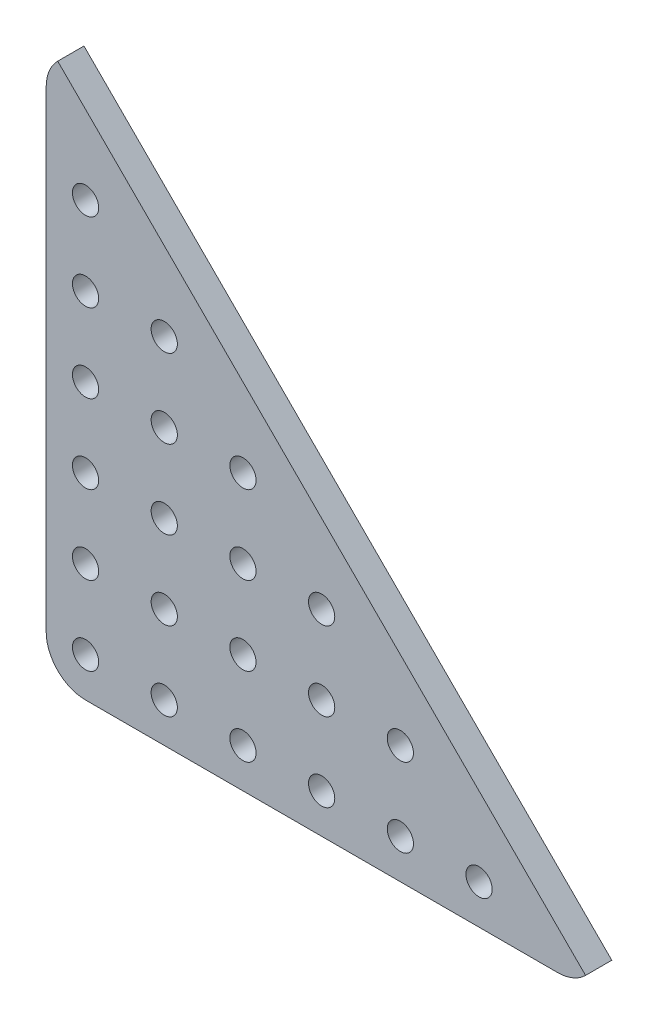
ISO-10303-21;
HEADER;
FILE_DESCRIPTION(('STEP AP214'),'2;1');
FILE_NAME('part.step','',(''),(''),'','','');
FILE_SCHEMA(('AUTOMOTIVE_DESIGN { 1 0 10303 214 1 1 1 1 }'));
ENDSEC;
DATA;
#1=APPLICATION_CONTEXT('core data for automotive mechanical design processes');
#2=APPLICATION_PROTOCOL_DEFINITION('international standard','automotive_design',2000,#1);
#3=PRODUCT_CONTEXT('',#1,'mechanical');
#4=PRODUCT('Part','Part','',(#3));
#5=PRODUCT_RELATED_PRODUCT_CATEGORY('part','',(#4));
#6=PRODUCT_DEFINITION_FORMATION('','',#4);
#7=PRODUCT_DEFINITION_CONTEXT('part definition',#1,'design');
#8=PRODUCT_DEFINITION('design','',#6,#7);
#9=PRODUCT_DEFINITION_SHAPE('','',#8);
#10=(LENGTH_UNIT() NAMED_UNIT(*) SI_UNIT(.MILLI.,.METRE.));
#11=(NAMED_UNIT(*) PLANE_ANGLE_UNIT() SI_UNIT($,.RADIAN.));
#12=(NAMED_UNIT(*) SI_UNIT($,.STERADIAN.) SOLID_ANGLE_UNIT());
#13=UNCERTAINTY_MEASURE_WITH_UNIT(LENGTH_MEASURE(1.E-05),#10,'distance_accuracy_value','');
#14=(GEOMETRIC_REPRESENTATION_CONTEXT(3) GLOBAL_UNCERTAINTY_ASSIGNED_CONTEXT((#13)) GLOBAL_UNIT_ASSIGNED_CONTEXT((#10,
#11,#12)) REPRESENTATION_CONTEXT('',''));
#15=CARTESIAN_POINT('',(0.,0.,0.));
#16=DIRECTION('',(0.,0.,1.));
#17=DIRECTION('',(1.,0.,0.));
#18=AXIS2_PLACEMENT_3D('',#15,#16,#17);
#19=CARTESIAN_POINT('',(-101.443383637,101.056539337921,3.));
#20=DIRECTION('',(0.,0.,1.));
#21=DIRECTION('',(1.,0.,0.));
#22=AXIS2_PLACEMENT_3D('',#19,#20,#21);
#23=PLANE('',#22);
#24=CARTESIAN_POINT('',(-65.443383637,47.056539338,3.));
#25=DIRECTION('',(0.,0.,1.));
#26=DIRECTION('',(1.,0.,0.));
#27=AXIS2_PLACEMENT_3D('',#24,#25,#26);
#28=CIRCLE('',#27,1.5);
#29=CARTESIAN_POINT('',(-63.943383637,47.056539338,3.));
#30=VERTEX_POINT('',#29);
#31=EDGE_CURVE('E258',#30,#30,#28,.T.);
#32=ORIENTED_EDGE('',*,*,#31,.F.);
#33=EDGE_LOOP('',(#32));
#34=FACE_BOUND('',#33,.T.);
#35=CARTESIAN_POINT('',(-83.443383637,47.056539338,3.));
#36=DIRECTION('',(0.,0.,1.));
#37=DIRECTION('',(1.,0.,0.));
#38=AXIS2_PLACEMENT_3D('',#35,#36,#37);
#39=CIRCLE('',#38,1.5);
#40=CARTESIAN_POINT('',(-81.943383637,47.056539338,3.));
#41=VERTEX_POINT('',#40);
#42=EDGE_CURVE('E270',#41,#41,#39,.T.);
#43=ORIENTED_EDGE('',*,*,#42,.F.);
#44=EDGE_LOOP('',(#43));
#45=FACE_BOUND('',#44,.T.);
#46=CARTESIAN_POINT('',(-101.443383637,47.056539338,3.));
#47=DIRECTION('',(0.,0.,1.));
#48=DIRECTION('',(1.,0.,0.));
#49=AXIS2_PLACEMENT_3D('',#46,#47,#48);
#50=CIRCLE('',#49,1.5);
#51=CARTESIAN_POINT('',(-99.943383637,47.056539338,3.));
#52=VERTEX_POINT('',#51);
#53=EDGE_CURVE('E282',#52,#52,#50,.T.);
#54=ORIENTED_EDGE('',*,*,#53,.F.);
#55=EDGE_LOOP('',(#54));
#56=FACE_BOUND('',#55,.T.);
#57=CARTESIAN_POINT('',(-74.443383637,56.056539338,3.));
#58=DIRECTION('',(0.,0.,1.));
#59=DIRECTION('',(1.,0.,0.));
#60=AXIS2_PLACEMENT_3D('',#57,#58,#59);
#61=CIRCLE('',#60,1.5);
#62=CARTESIAN_POINT('',(-72.943383637,56.056539338,3.));
#63=VERTEX_POINT('',#62);
#64=EDGE_CURVE('E294',#63,#63,#61,.T.);
#65=ORIENTED_EDGE('',*,*,#64,.F.);
#66=EDGE_LOOP('',(#65));
#67=FACE_BOUND('',#66,.T.);
#68=CARTESIAN_POINT('',(-92.443383637,56.056539338,3.));
#69=DIRECTION('',(0.,0.,1.));
#70=DIRECTION('',(1.,0.,0.));
#71=AXIS2_PLACEMENT_3D('',#68,#69,#70);
#72=CIRCLE('',#71,1.5);
#73=CARTESIAN_POINT('',(-90.943383637,56.056539338,3.));
#74=VERTEX_POINT('',#73);
#75=EDGE_CURVE('E306',#74,#74,#72,.T.);
#76=ORIENTED_EDGE('',*,*,#75,.F.);
#77=EDGE_LOOP('',(#76));
#78=FACE_BOUND('',#77,.T.);
#79=CARTESIAN_POINT('',(-74.443383637,65.056539338,3.));
#80=DIRECTION('',(0.,0.,1.));
#81=DIRECTION('',(1.,0.,0.));
#82=AXIS2_PLACEMENT_3D('',#79,#80,#81);
#83=CIRCLE('',#82,1.5);
#84=CARTESIAN_POINT('',(-72.943383637,65.056539338,3.));
#85=VERTEX_POINT('',#84);
#86=EDGE_CURVE('E318',#85,#85,#83,.T.);
#87=ORIENTED_EDGE('',*,*,#86,.F.);
#88=EDGE_LOOP('',(#87));
#89=FACE_BOUND('',#88,.T.);
#90=CARTESIAN_POINT('',(-92.443383637,65.056539338,3.));
#91=DIRECTION('',(0.,0.,1.));
#92=DIRECTION('',(1.,0.,0.));
#93=AXIS2_PLACEMENT_3D('',#90,#91,#92);
#94=CIRCLE('',#93,1.5);
#95=CARTESIAN_POINT('',(-90.943383637,65.056539338,3.));
#96=VERTEX_POINT('',#95);
#97=EDGE_CURVE('E330',#96,#96,#94,.T.);
#98=ORIENTED_EDGE('',*,*,#97,.F.);
#99=EDGE_LOOP('',(#98));
#100=FACE_BOUND('',#99,.T.);
#101=CARTESIAN_POINT('',(-83.443383637,74.056539338,3.));
#102=DIRECTION('',(0.,0.,1.));
#103=DIRECTION('',(1.,0.,0.));
#104=AXIS2_PLACEMENT_3D('',#101,#102,#103);
#105=CIRCLE('',#104,1.5);
#106=CARTESIAN_POINT('',(-81.943383637,74.056539338,3.));
#107=VERTEX_POINT('',#106);
#108=EDGE_CURVE('E342',#107,#107,#105,.T.);
#109=ORIENTED_EDGE('',*,*,#108,.F.);
#110=EDGE_LOOP('',(#109));
#111=FACE_BOUND('',#110,.T.);
#112=CARTESIAN_POINT('',(-101.443383637,74.056539338,3.));
#113=DIRECTION('',(0.,0.,1.));
#114=DIRECTION('',(1.,0.,0.));
#115=AXIS2_PLACEMENT_3D('',#112,#113,#114);
#116=CIRCLE('',#115,1.5);
#117=CARTESIAN_POINT('',(-99.943383637,74.056539338,3.));
#118=VERTEX_POINT('',#117);
#119=EDGE_CURVE('E354',#118,#118,#116,.T.);
#120=ORIENTED_EDGE('',*,*,#119,.F.);
#121=EDGE_LOOP('',(#120));
#122=FACE_BOUND('',#121,.T.);
#123=CARTESIAN_POINT('',(-101.443383637,83.056539338,3.));
#124=DIRECTION('',(0.,0.,1.));
#125=DIRECTION('',(1.,0.,0.));
#126=AXIS2_PLACEMENT_3D('',#123,#124,#125);
#127=CIRCLE('',#126,1.5);
#128=CARTESIAN_POINT('',(-99.943383637,83.056539338,3.));
#129=VERTEX_POINT('',#128);
#130=EDGE_CURVE('E366',#129,#129,#127,.T.);
#131=ORIENTED_EDGE('',*,*,#130,.F.);
#132=EDGE_LOOP('',(#131));
#133=FACE_BOUND('',#132,.T.);
#134=CARTESIAN_POINT('',(-101.443383637,101.056539337921,3.));
#135=DIRECTION('',(0.,0.,1.));
#136=DIRECTION('',(1.,0.,0.));
#137=AXIS2_PLACEMENT_3D('',#134,#135,#136);
#138=CIRCLE('',#137,4.50000000000001);
#139=CARTESIAN_POINT('',(-104.6253641523,104.2385198533,3.));
#140=VERTEX_POINT('',#139);
#141=CARTESIAN_POINT('',(-105.943383637,101.056539338,3.));
#142=VERTEX_POINT('',#141);
#143=EDGE_CURVE('E129',#140,#142,#138,.T.);
#144=ORIENTED_EDGE('',*,*,#143,.T.);
#145=DIRECTION('',(0.,-1.,0.));
#146=VECTOR('',#145,1.);
#147=CARTESIAN_POINT('',(-105.943383637,101.056539338,3.));
#148=LINE('',#147,#146);
#149=CARTESIAN_POINT('',(-105.943383637,47.056539338,3.));
#150=VERTEX_POINT('',#149);
#151=EDGE_CURVE('E87',#142,#150,#148,.T.);
#152=ORIENTED_EDGE('',*,*,#151,.T.);
#153=CARTESIAN_POINT('',(-101.443383637,47.056539338,3.));
#154=DIRECTION('',(0.,0.,1.));
#155=DIRECTION('',(1.,0.,0.));
#156=AXIS2_PLACEMENT_3D('',#153,#154,#155);
#157=CIRCLE('',#156,4.5);
#158=CARTESIAN_POINT('',(-101.443383637,42.556539338,3.));
#159=VERTEX_POINT('',#158);
#160=EDGE_CURVE('E100',#150,#159,#157,.T.);
#161=ORIENTED_EDGE('',*,*,#160,.T.);
#162=DIRECTION('',(1.,0.,0.));
#163=VECTOR('',#162,1.);
#164=CARTESIAN_POINT('',(-101.443383637,42.556539338,3.));
#165=LINE('',#164,#163);
#166=CARTESIAN_POINT('',(-47.443383637,42.556539338,3.));
#167=VERTEX_POINT('',#166);
#168=EDGE_CURVE('E94',#159,#167,#165,.T.);
#169=ORIENTED_EDGE('',*,*,#168,.T.);
#170=CARTESIAN_POINT('',(-47.4433836370789,47.056539338,3.));
#171=DIRECTION('',(0.,0.,1.));
#172=DIRECTION('',(1.,0.,0.));
#173=AXIS2_PLACEMENT_3D('',#170,#171,#172);
#174=CIRCLE('',#173,4.5);
#175=CARTESIAN_POINT('',(-44.2614031217,43.8745588227,3.));
#176=VERTEX_POINT('',#175);
#177=EDGE_CURVE('E98',#167,#176,#174,.T.);
#178=ORIENTED_EDGE('',*,*,#177,.T.);
#179=DIRECTION('',(-0.707106781186547,0.707106781186548,0.));
#180=VECTOR('',#179,1.);
#181=CARTESIAN_POINT('',(-104.6253641523,104.2385198533,3.));
#182=LINE('',#181,#180);
#183=EDGE_CURVE('E50',#176,#140,#182,.T.);
#184=ORIENTED_EDGE('',*,*,#183,.T.);
#185=EDGE_LOOP('',(#144,#152,#161,#169,#178,#184));
#186=FACE_BOUND('',#185,.T.);
#187=CARTESIAN_POINT('',(-101.443383637,92.056539338,3.));
#188=DIRECTION('',(0.,0.,1.));
#189=DIRECTION('',(1.,0.,0.));
#190=AXIS2_PLACEMENT_3D('',#187,#188,#189);
#191=CIRCLE('',#190,1.5);
#192=CARTESIAN_POINT('',(-99.943383637,92.056539338,3.));
#193=VERTEX_POINT('',#192);
#194=EDGE_CURVE('E122',#193,#193,#191,.T.);
#195=ORIENTED_EDGE('',*,*,#194,.F.);
#196=EDGE_LOOP('',(#195));
#197=FACE_BOUND('',#196,.T.);
#198=CARTESIAN_POINT('',(-92.443383637,83.056539338,3.));
#199=DIRECTION('',(0.,0.,1.));
#200=DIRECTION('',(1.,0.,0.));
#201=AXIS2_PLACEMENT_3D('',#198,#199,#200);
#202=CIRCLE('',#201,1.5);
#203=CARTESIAN_POINT('',(-90.943383637,83.056539338,3.));
#204=VERTEX_POINT('',#203);
#205=EDGE_CURVE('E360',#204,#204,#202,.T.);
#206=ORIENTED_EDGE('',*,*,#205,.F.);
#207=EDGE_LOOP('',(#206));
#208=FACE_BOUND('',#207,.T.);
#209=CARTESIAN_POINT('',(-92.443383637,74.056539338,3.));
#210=DIRECTION('',(0.,0.,1.));
#211=DIRECTION('',(1.,0.,0.));
#212=AXIS2_PLACEMENT_3D('',#209,#210,#211);
#213=CIRCLE('',#212,1.5);
#214=CARTESIAN_POINT('',(-90.943383637,74.056539338,3.));
#215=VERTEX_POINT('',#214);
#216=EDGE_CURVE('E348',#215,#215,#213,.T.);
#217=ORIENTED_EDGE('',*,*,#216,.F.);
#218=EDGE_LOOP('',(#217));
#219=FACE_BOUND('',#218,.T.);
#220=CARTESIAN_POINT('',(-101.443383637,65.056539338,3.));
#221=DIRECTION('',(0.,0.,1.));
#222=DIRECTION('',(1.,0.,0.));
#223=AXIS2_PLACEMENT_3D('',#220,#221,#222);
#224=CIRCLE('',#223,1.5);
#225=CARTESIAN_POINT('',(-99.943383637,65.056539338,3.));
#226=VERTEX_POINT('',#225);
#227=EDGE_CURVE('E336',#226,#226,#224,.T.);
#228=ORIENTED_EDGE('',*,*,#227,.F.);
#229=EDGE_LOOP('',(#228));
#230=FACE_BOUND('',#229,.T.);
#231=CARTESIAN_POINT('',(-83.443383637,65.056539338,3.));
#232=DIRECTION('',(0.,0.,1.));
#233=DIRECTION('',(1.,0.,0.));
#234=AXIS2_PLACEMENT_3D('',#231,#232,#233);
#235=CIRCLE('',#234,1.5);
#236=CARTESIAN_POINT('',(-81.943383637,65.056539338,3.));
#237=VERTEX_POINT('',#236);
#238=EDGE_CURVE('E324',#237,#237,#235,.T.);
#239=ORIENTED_EDGE('',*,*,#238,.F.);
#240=EDGE_LOOP('',(#239));
#241=FACE_BOUND('',#240,.T.);
#242=CARTESIAN_POINT('',(-101.443383637,56.056539338,3.));
#243=DIRECTION('',(0.,0.,1.));
#244=DIRECTION('',(1.,0.,0.));
#245=AXIS2_PLACEMENT_3D('',#242,#243,#244);
#246=CIRCLE('',#245,1.5);
#247=CARTESIAN_POINT('',(-99.943383637,56.056539338,3.));
#248=VERTEX_POINT('',#247);
#249=EDGE_CURVE('E312',#248,#248,#246,.T.);
#250=ORIENTED_EDGE('',*,*,#249,.F.);
#251=EDGE_LOOP('',(#250));
#252=FACE_BOUND('',#251,.T.);
#253=CARTESIAN_POINT('',(-83.443383637,56.056539338,3.));
#254=DIRECTION('',(0.,0.,1.));
#255=DIRECTION('',(1.,0.,0.));
#256=AXIS2_PLACEMENT_3D('',#253,#254,#255);
#257=CIRCLE('',#256,1.5);
#258=CARTESIAN_POINT('',(-81.943383637,56.056539338,3.));
#259=VERTEX_POINT('',#258);
#260=EDGE_CURVE('E300',#259,#259,#257,.T.);
#261=ORIENTED_EDGE('',*,*,#260,.F.);
#262=EDGE_LOOP('',(#261));
#263=FACE_BOUND('',#262,.T.);
#264=CARTESIAN_POINT('',(-65.443383637,56.056539338,3.));
#265=DIRECTION('',(0.,0.,1.));
#266=DIRECTION('',(1.,0.,0.));
#267=AXIS2_PLACEMENT_3D('',#264,#265,#266);
#268=CIRCLE('',#267,1.5);
#269=CARTESIAN_POINT('',(-63.943383637,56.056539338,3.));
#270=VERTEX_POINT('',#269);
#271=EDGE_CURVE('E288',#270,#270,#268,.T.);
#272=ORIENTED_EDGE('',*,*,#271,.F.);
#273=EDGE_LOOP('',(#272));
#274=FACE_BOUND('',#273,.T.);
#275=CARTESIAN_POINT('',(-92.443383637,47.056539338,3.));
#276=DIRECTION('',(0.,0.,1.));
#277=DIRECTION('',(1.,0.,0.));
#278=AXIS2_PLACEMENT_3D('',#275,#276,#277);
#279=CIRCLE('',#278,1.5);
#280=CARTESIAN_POINT('',(-90.943383637,47.056539338,3.));
#281=VERTEX_POINT('',#280);
#282=EDGE_CURVE('E276',#281,#281,#279,.T.);
#283=ORIENTED_EDGE('',*,*,#282,.F.);
#284=EDGE_LOOP('',(#283));
#285=FACE_BOUND('',#284,.T.);
#286=CARTESIAN_POINT('',(-74.443383637,47.056539338,3.));
#287=DIRECTION('',(0.,0.,1.));
#288=DIRECTION('',(1.,0.,0.));
#289=AXIS2_PLACEMENT_3D('',#286,#287,#288);
#290=CIRCLE('',#289,1.5);
#291=CARTESIAN_POINT('',(-72.943383637,47.056539338,3.));
#292=VERTEX_POINT('',#291);
#293=EDGE_CURVE('E264',#292,#292,#290,.T.);
#294=ORIENTED_EDGE('',*,*,#293,.F.);
#295=EDGE_LOOP('',(#294));
#296=FACE_BOUND('',#295,.T.);
#297=CARTESIAN_POINT('',(-56.443383637,47.056539338,3.));
#298=DIRECTION('',(0.,0.,1.));
#299=DIRECTION('',(1.,0.,0.));
#300=AXIS2_PLACEMENT_3D('',#297,#298,#299);
#301=CIRCLE('',#300,1.5);
#302=CARTESIAN_POINT('',(-54.943383637,47.056539338,3.));
#303=VERTEX_POINT('',#302);
#304=EDGE_CURVE('E249',#303,#303,#301,.T.);
#305=ORIENTED_EDGE('',*,*,#304,.F.);
#306=EDGE_LOOP('',(#305));
#307=FACE_BOUND('',#306,.T.);
#308=ADVANCED_FACE('F33',(#34,#45,#56,#67,#78,#89,#100,#111,#122,#133,#186,#197,#208,#219,#230,
#241,#252,#263,#274,#285,#296,#307),#23,.T.);
#309=CARTESIAN_POINT('',(-101.443383637,101.056539337921,0.));
#310=DIRECTION('',(0.,0.,1.));
#311=DIRECTION('',(1.,0.,0.));
#312=AXIS2_PLACEMENT_3D('',#309,#310,#311);
#313=PLANE('',#312);
#314=CARTESIAN_POINT('',(-65.443383637,47.056539338,0.));
#315=DIRECTION('',(0.,0.,1.));
#316=DIRECTION('',(1.,0.,0.));
#317=AXIS2_PLACEMENT_3D('',#314,#315,#316);
#318=CIRCLE('',#317,1.5);
#319=CARTESIAN_POINT('',(-63.943383637,47.056539338,0.));
#320=VERTEX_POINT('',#319);
#321=EDGE_CURVE('E255',#320,#320,#318,.T.);
#322=ORIENTED_EDGE('',*,*,#321,.T.);
#323=EDGE_LOOP('',(#322));
#324=FACE_BOUND('',#323,.T.);
#325=CARTESIAN_POINT('',(-83.443383637,47.056539338,0.));
#326=DIRECTION('',(0.,0.,1.));
#327=DIRECTION('',(1.,0.,0.));
#328=AXIS2_PLACEMENT_3D('',#325,#326,#327);
#329=CIRCLE('',#328,1.5);
#330=CARTESIAN_POINT('',(-81.943383637,47.056539338,0.));
#331=VERTEX_POINT('',#330);
#332=EDGE_CURVE('E267',#331,#331,#329,.T.);
#333=ORIENTED_EDGE('',*,*,#332,.T.);
#334=EDGE_LOOP('',(#333));
#335=FACE_BOUND('',#334,.T.);
#336=CARTESIAN_POINT('',(-101.443383637,47.056539338,0.));
#337=DIRECTION('',(0.,0.,1.));
#338=DIRECTION('',(1.,0.,0.));
#339=AXIS2_PLACEMENT_3D('',#336,#337,#338);
#340=CIRCLE('',#339,1.5);
#341=CARTESIAN_POINT('',(-99.943383637,47.056539338,0.));
#342=VERTEX_POINT('',#341);
#343=EDGE_CURVE('E279',#342,#342,#340,.T.);
#344=ORIENTED_EDGE('',*,*,#343,.T.);
#345=EDGE_LOOP('',(#344));
#346=FACE_BOUND('',#345,.T.);
#347=CARTESIAN_POINT('',(-74.443383637,56.056539338,0.));
#348=DIRECTION('',(0.,0.,1.));
#349=DIRECTION('',(1.,0.,0.));
#350=AXIS2_PLACEMENT_3D('',#347,#348,#349);
#351=CIRCLE('',#350,1.5);
#352=CARTESIAN_POINT('',(-72.943383637,56.056539338,0.));
#353=VERTEX_POINT('',#352);
#354=EDGE_CURVE('E291',#353,#353,#351,.T.);
#355=ORIENTED_EDGE('',*,*,#354,.T.);
#356=EDGE_LOOP('',(#355));
#357=FACE_BOUND('',#356,.T.);
#358=CARTESIAN_POINT('',(-92.443383637,56.056539338,0.));
#359=DIRECTION('',(0.,0.,1.));
#360=DIRECTION('',(1.,0.,0.));
#361=AXIS2_PLACEMENT_3D('',#358,#359,#360);
#362=CIRCLE('',#361,1.5);
#363=CARTESIAN_POINT('',(-90.943383637,56.056539338,0.));
#364=VERTEX_POINT('',#363);
#365=EDGE_CURVE('E303',#364,#364,#362,.T.);
#366=ORIENTED_EDGE('',*,*,#365,.T.);
#367=EDGE_LOOP('',(#366));
#368=FACE_BOUND('',#367,.T.);
#369=CARTESIAN_POINT('',(-74.443383637,65.056539338,0.));
#370=DIRECTION('',(0.,0.,1.));
#371=DIRECTION('',(1.,0.,0.));
#372=AXIS2_PLACEMENT_3D('',#369,#370,#371);
#373=CIRCLE('',#372,1.5);
#374=CARTESIAN_POINT('',(-72.943383637,65.056539338,0.));
#375=VERTEX_POINT('',#374);
#376=EDGE_CURVE('E315',#375,#375,#373,.T.);
#377=ORIENTED_EDGE('',*,*,#376,.T.);
#378=EDGE_LOOP('',(#377));
#379=FACE_BOUND('',#378,.T.);
#380=CARTESIAN_POINT('',(-92.443383637,65.056539338,0.));
#381=DIRECTION('',(0.,0.,1.));
#382=DIRECTION('',(1.,0.,0.));
#383=AXIS2_PLACEMENT_3D('',#380,#381,#382);
#384=CIRCLE('',#383,1.5);
#385=CARTESIAN_POINT('',(-90.943383637,65.056539338,0.));
#386=VERTEX_POINT('',#385);
#387=EDGE_CURVE('E327',#386,#386,#384,.T.);
#388=ORIENTED_EDGE('',*,*,#387,.T.);
#389=EDGE_LOOP('',(#388));
#390=FACE_BOUND('',#389,.T.);
#391=CARTESIAN_POINT('',(-83.443383637,74.056539338,0.));
#392=DIRECTION('',(0.,0.,1.));
#393=DIRECTION('',(1.,0.,0.));
#394=AXIS2_PLACEMENT_3D('',#391,#392,#393);
#395=CIRCLE('',#394,1.5);
#396=CARTESIAN_POINT('',(-81.943383637,74.056539338,0.));
#397=VERTEX_POINT('',#396);
#398=EDGE_CURVE('E339',#397,#397,#395,.T.);
#399=ORIENTED_EDGE('',*,*,#398,.T.);
#400=EDGE_LOOP('',(#399));
#401=FACE_BOUND('',#400,.T.);
#402=CARTESIAN_POINT('',(-101.443383637,74.056539338,0.));
#403=DIRECTION('',(0.,0.,1.));
#404=DIRECTION('',(1.,0.,0.));
#405=AXIS2_PLACEMENT_3D('',#402,#403,#404);
#406=CIRCLE('',#405,1.5);
#407=CARTESIAN_POINT('',(-99.943383637,74.056539338,0.));
#408=VERTEX_POINT('',#407);
#409=EDGE_CURVE('E351',#408,#408,#406,.T.);
#410=ORIENTED_EDGE('',*,*,#409,.T.);
#411=EDGE_LOOP('',(#410));
#412=FACE_BOUND('',#411,.T.);
#413=CARTESIAN_POINT('',(-101.443383637,83.056539338,0.));
#414=DIRECTION('',(0.,0.,1.));
#415=DIRECTION('',(1.,0.,0.));
#416=AXIS2_PLACEMENT_3D('',#413,#414,#415);
#417=CIRCLE('',#416,1.5);
#418=CARTESIAN_POINT('',(-99.943383637,83.056539338,0.));
#419=VERTEX_POINT('',#418);
#420=EDGE_CURVE('E363',#419,#419,#417,.T.);
#421=ORIENTED_EDGE('',*,*,#420,.T.);
#422=EDGE_LOOP('',(#421));
#423=FACE_BOUND('',#422,.T.);
#424=CARTESIAN_POINT('',(-101.443383637,101.056539337921,0.));
#425=DIRECTION('',(0.,0.,1.));
#426=DIRECTION('',(1.,0.,0.));
#427=AXIS2_PLACEMENT_3D('',#424,#425,#426);
#428=CIRCLE('',#427,4.50000000000001);
#429=CARTESIAN_POINT('',(-104.6253641523,104.2385198533,0.));
#430=VERTEX_POINT('',#429);
#431=CARTESIAN_POINT('',(-105.943383637,101.056539338,0.));
#432=VERTEX_POINT('',#431);
#433=EDGE_CURVE('E118',#430,#432,#428,.T.);
#434=ORIENTED_EDGE('',*,*,#433,.F.);
#435=DIRECTION('',(-0.707106781186547,0.707106781186548,0.));
#436=VECTOR('',#435,1.);
#437=CARTESIAN_POINT('',(-104.6253641523,104.2385198533,0.));
#438=LINE('',#437,#436);
#439=CARTESIAN_POINT('',(-44.2614031217,43.8745588227,0.));
#440=VERTEX_POINT('',#439);
#441=EDGE_CURVE('E79',#440,#430,#438,.T.);
#442=ORIENTED_EDGE('',*,*,#441,.F.);
#443=CARTESIAN_POINT('',(-47.4433836370789,47.056539338,0.));
#444=DIRECTION('',(0.,0.,1.));
#445=DIRECTION('',(1.,0.,0.));
#446=AXIS2_PLACEMENT_3D('',#443,#444,#445);
#447=CIRCLE('',#446,4.5);
#448=CARTESIAN_POINT('',(-47.443383637,42.556539338,0.));
#449=VERTEX_POINT('',#448);
#450=EDGE_CURVE('E73',#449,#440,#447,.T.);
#451=ORIENTED_EDGE('',*,*,#450,.F.);
#452=DIRECTION('',(1.,0.,0.));
#453=VECTOR('',#452,1.);
#454=CARTESIAN_POINT('',(-101.443383637,42.556539338,0.));
#455=LINE('',#454,#453);
#456=CARTESIAN_POINT('',(-101.443383637,42.556539338,0.));
#457=VERTEX_POINT('',#456);
#458=EDGE_CURVE('E108',#457,#449,#455,.T.);
#459=ORIENTED_EDGE('',*,*,#458,.F.);
#460=CARTESIAN_POINT('',(-101.443383637,47.056539338,0.));
#461=DIRECTION('',(0.,0.,1.));
#462=DIRECTION('',(1.,0.,0.));
#463=AXIS2_PLACEMENT_3D('',#460,#461,#462);
#464=CIRCLE('',#463,4.5);
#465=CARTESIAN_POINT('',(-105.943383637,47.056539338,0.));
#466=VERTEX_POINT('',#465);
#467=EDGE_CURVE('E124',#466,#457,#464,.T.);
#468=ORIENTED_EDGE('',*,*,#467,.F.);
#469=DIRECTION('',(0.,-1.,0.));
#470=VECTOR('',#469,1.);
#471=CARTESIAN_POINT('',(-105.943383637,101.056539338,0.));
#472=LINE('',#471,#470);
#473=EDGE_CURVE('E121',#432,#466,#472,.T.);
#474=ORIENTED_EDGE('',*,*,#473,.F.);
#475=EDGE_LOOP('',(#434,#442,#451,#459,#468,#474));
#476=FACE_BOUND('',#475,.T.);
#477=CARTESIAN_POINT('',(-101.443383637,92.056539338,0.));
#478=DIRECTION('',(0.,0.,1.));
#479=DIRECTION('',(1.,0.,0.));
#480=AXIS2_PLACEMENT_3D('',#477,#478,#479);
#481=CIRCLE('',#480,1.5);
#482=CARTESIAN_POINT('',(-99.943383637,92.056539338,0.));
#483=VERTEX_POINT('',#482);
#484=EDGE_CURVE('E369',#483,#483,#481,.T.);
#485=ORIENTED_EDGE('',*,*,#484,.T.);
#486=EDGE_LOOP('',(#485));
#487=FACE_BOUND('',#486,.T.);
#488=CARTESIAN_POINT('',(-92.443383637,83.056539338,0.));
#489=DIRECTION('',(0.,0.,1.));
#490=DIRECTION('',(1.,0.,0.));
#491=AXIS2_PLACEMENT_3D('',#488,#489,#490);
#492=CIRCLE('',#491,1.5);
#493=CARTESIAN_POINT('',(-90.943383637,83.056539338,0.));
#494=VERTEX_POINT('',#493);
#495=EDGE_CURVE('E357',#494,#494,#492,.T.);
#496=ORIENTED_EDGE('',*,*,#495,.T.);
#497=EDGE_LOOP('',(#496));
#498=FACE_BOUND('',#497,.T.);
#499=CARTESIAN_POINT('',(-92.443383637,74.056539338,0.));
#500=DIRECTION('',(0.,0.,1.));
#501=DIRECTION('',(1.,0.,0.));
#502=AXIS2_PLACEMENT_3D('',#499,#500,#501);
#503=CIRCLE('',#502,1.5);
#504=CARTESIAN_POINT('',(-90.943383637,74.056539338,0.));
#505=VERTEX_POINT('',#504);
#506=EDGE_CURVE('E345',#505,#505,#503,.T.);
#507=ORIENTED_EDGE('',*,*,#506,.T.);
#508=EDGE_LOOP('',(#507));
#509=FACE_BOUND('',#508,.T.);
#510=CARTESIAN_POINT('',(-101.443383637,65.056539338,0.));
#511=DIRECTION('',(0.,0.,1.));
#512=DIRECTION('',(1.,0.,0.));
#513=AXIS2_PLACEMENT_3D('',#510,#511,#512);
#514=CIRCLE('',#513,1.5);
#515=CARTESIAN_POINT('',(-99.943383637,65.056539338,0.));
#516=VERTEX_POINT('',#515);
#517=EDGE_CURVE('E333',#516,#516,#514,.T.);
#518=ORIENTED_EDGE('',*,*,#517,.T.);
#519=EDGE_LOOP('',(#518));
#520=FACE_BOUND('',#519,.T.);
#521=CARTESIAN_POINT('',(-83.443383637,65.056539338,0.));
#522=DIRECTION('',(0.,0.,1.));
#523=DIRECTION('',(1.,0.,0.));
#524=AXIS2_PLACEMENT_3D('',#521,#522,#523);
#525=CIRCLE('',#524,1.5);
#526=CARTESIAN_POINT('',(-81.943383637,65.056539338,0.));
#527=VERTEX_POINT('',#526);
#528=EDGE_CURVE('E321',#527,#527,#525,.T.);
#529=ORIENTED_EDGE('',*,*,#528,.T.);
#530=EDGE_LOOP('',(#529));
#531=FACE_BOUND('',#530,.T.);
#532=CARTESIAN_POINT('',(-101.443383637,56.056539338,0.));
#533=DIRECTION('',(0.,0.,1.));
#534=DIRECTION('',(1.,0.,0.));
#535=AXIS2_PLACEMENT_3D('',#532,#533,#534);
#536=CIRCLE('',#535,1.5);
#537=CARTESIAN_POINT('',(-99.943383637,56.056539338,0.));
#538=VERTEX_POINT('',#537);
#539=EDGE_CURVE('E309',#538,#538,#536,.T.);
#540=ORIENTED_EDGE('',*,*,#539,.T.);
#541=EDGE_LOOP('',(#540));
#542=FACE_BOUND('',#541,.T.);
#543=CARTESIAN_POINT('',(-83.443383637,56.056539338,0.));
#544=DIRECTION('',(0.,0.,1.));
#545=DIRECTION('',(1.,0.,0.));
#546=AXIS2_PLACEMENT_3D('',#543,#544,#545);
#547=CIRCLE('',#546,1.5);
#548=CARTESIAN_POINT('',(-81.943383637,56.056539338,0.));
#549=VERTEX_POINT('',#548);
#550=EDGE_CURVE('E297',#549,#549,#547,.T.);
#551=ORIENTED_EDGE('',*,*,#550,.T.);
#552=EDGE_LOOP('',(#551));
#553=FACE_BOUND('',#552,.T.);
#554=CARTESIAN_POINT('',(-65.443383637,56.056539338,0.));
#555=DIRECTION('',(0.,0.,1.));
#556=DIRECTION('',(1.,0.,0.));
#557=AXIS2_PLACEMENT_3D('',#554,#555,#556);
#558=CIRCLE('',#557,1.5);
#559=CARTESIAN_POINT('',(-63.943383637,56.056539338,0.));
#560=VERTEX_POINT('',#559);
#561=EDGE_CURVE('E285',#560,#560,#558,.T.);
#562=ORIENTED_EDGE('',*,*,#561,.T.);
#563=EDGE_LOOP('',(#562));
#564=FACE_BOUND('',#563,.T.);
#565=CARTESIAN_POINT('',(-92.443383637,47.056539338,0.));
#566=DIRECTION('',(0.,0.,1.));
#567=DIRECTION('',(1.,0.,0.));
#568=AXIS2_PLACEMENT_3D('',#565,#566,#567);
#569=CIRCLE('',#568,1.5);
#570=CARTESIAN_POINT('',(-90.943383637,47.056539338,0.));
#571=VERTEX_POINT('',#570);
#572=EDGE_CURVE('E273',#571,#571,#569,.T.);
#573=ORIENTED_EDGE('',*,*,#572,.T.);
#574=EDGE_LOOP('',(#573));
#575=FACE_BOUND('',#574,.T.);
#576=CARTESIAN_POINT('',(-74.443383637,47.056539338,0.));
#577=DIRECTION('',(0.,0.,1.));
#578=DIRECTION('',(1.,0.,0.));
#579=AXIS2_PLACEMENT_3D('',#576,#577,#578);
#580=CIRCLE('',#579,1.5);
#581=CARTESIAN_POINT('',(-72.943383637,47.056539338,0.));
#582=VERTEX_POINT('',#581);
#583=EDGE_CURVE('E261',#582,#582,#580,.T.);
#584=ORIENTED_EDGE('',*,*,#583,.T.);
#585=EDGE_LOOP('',(#584));
#586=FACE_BOUND('',#585,.T.);
#587=CARTESIAN_POINT('',(-56.443383637,47.056539338,0.));
#588=DIRECTION('',(0.,0.,1.));
#589=DIRECTION('',(1.,0.,0.));
#590=AXIS2_PLACEMENT_3D('',#587,#588,#589);
#591=CIRCLE('',#590,1.5);
#592=CARTESIAN_POINT('',(-54.943383637,47.056539338,0.));
#593=VERTEX_POINT('',#592);
#594=EDGE_CURVE('E252',#593,#593,#591,.T.);
#595=ORIENTED_EDGE('',*,*,#594,.T.);
#596=EDGE_LOOP('',(#595));
#597=FACE_BOUND('',#596,.T.);
#598=ADVANCED_FACE('F138',(#324,#335,#346,#357,#368,#379,#390,#401,#412,#423,#476,#487,#498,
#509,#520,#531,#542,#553,#564,#575,#586,#597),#313,.F.);
#599=CARTESIAN_POINT('',(-101.443383637,101.056539337921,3.));
#600=DIRECTION('',(0.,0.,-1.));
#601=DIRECTION('',(-1.,0.,0.));
#602=AXIS2_PLACEMENT_3D('',#599,#600,#601);
#603=CYLINDRICAL_SURFACE('',#602,4.50000000000001);
#604=ORIENTED_EDGE('',*,*,#433,.T.);
#605=DIRECTION('',(0.,0.,-1.));
#606=VECTOR('',#605,1.);
#607=CARTESIAN_POINT('',(-105.943383637,101.056539338,3.));
#608=LINE('',#607,#606);
#609=EDGE_CURVE('E11',#142,#432,#608,.T.);
#610=ORIENTED_EDGE('',*,*,#609,.F.);
#611=ORIENTED_EDGE('',*,*,#143,.F.);
#612=DIRECTION('',(0.,0.,-1.));
#613=VECTOR('',#612,1.);
#614=CARTESIAN_POINT('',(-104.6253641523,104.2385198533,3.));
#615=LINE('',#614,#613);
#616=EDGE_CURVE('E114',#140,#430,#615,.T.);
#617=ORIENTED_EDGE('',*,*,#616,.T.);
#618=EDGE_LOOP('',(#604,#610,#611,#617));
#619=FACE_BOUND('',#618,.T.);
#620=ADVANCED_FACE('F35',(#619),#603,.T.);
#621=CARTESIAN_POINT('',(-105.943383637,101.056539338,3.));
#622=DIRECTION('',(1.,0.,0.));
#623=DIRECTION('',(0.,0.,-1.));
#624=AXIS2_PLACEMENT_3D('',#621,#622,#623);
#625=PLANE('',#624);
#626=ORIENTED_EDGE('',*,*,#473,.T.);
#627=DIRECTION('',(0.,0.,-1.));
#628=VECTOR('',#627,1.);
#629=CARTESIAN_POINT('',(-105.943383637,47.056539338,3.));
#630=LINE('',#629,#628);
#631=EDGE_CURVE('E42',#150,#466,#630,.T.);
#632=ORIENTED_EDGE('',*,*,#631,.F.);
#633=ORIENTED_EDGE('',*,*,#151,.F.);
#634=ORIENTED_EDGE('',*,*,#609,.T.);
#635=EDGE_LOOP('',(#626,#632,#633,#634));
#636=FACE_BOUND('',#635,.T.);
#637=ADVANCED_FACE('F579',(#636),#625,.F.);
#638=CARTESIAN_POINT('',(-101.443383637,47.056539338,3.));
#639=DIRECTION('',(0.,0.,-1.));
#640=DIRECTION('',(-1.,0.,0.));
#641=AXIS2_PLACEMENT_3D('',#638,#639,#640);
#642=CYLINDRICAL_SURFACE('',#641,4.5);
#643=ORIENTED_EDGE('',*,*,#467,.T.);
#644=DIRECTION('',(0.,0.,-1.));
#645=VECTOR('',#644,1.);
#646=CARTESIAN_POINT('',(-101.443383637,42.556539338,3.));
#647=LINE('',#646,#645);
#648=EDGE_CURVE('E109',#159,#457,#647,.T.);
#649=ORIENTED_EDGE('',*,*,#648,.F.);
#650=ORIENTED_EDGE('',*,*,#160,.F.);
#651=ORIENTED_EDGE('',*,*,#631,.T.);
#652=EDGE_LOOP('',(#643,#649,#650,#651));
#653=FACE_BOUND('',#652,.T.);
#654=ADVANCED_FACE('F135',(#653),#642,.T.);
#655=CARTESIAN_POINT('',(-101.443383637,42.556539338,3.));
#656=DIRECTION('',(0.,1.,0.));
#657=DIRECTION('',(0.,0.,1.));
#658=AXIS2_PLACEMENT_3D('',#655,#656,#657);
#659=PLANE('',#658);
#660=ORIENTED_EDGE('',*,*,#458,.T.);
#661=DIRECTION('',(0.,0.,-1.));
#662=VECTOR('',#661,1.);
#663=CARTESIAN_POINT('',(-47.443383637,42.556539338,3.));
#664=LINE('',#663,#662);
#665=EDGE_CURVE('E105',#167,#449,#664,.T.);
#666=ORIENTED_EDGE('',*,*,#665,.F.);
#667=ORIENTED_EDGE('',*,*,#168,.F.);
#668=ORIENTED_EDGE('',*,*,#648,.T.);
#669=EDGE_LOOP('',(#660,#666,#667,#668));
#670=FACE_BOUND('',#669,.T.);
#671=ADVANCED_FACE('F106',(#670),#659,.F.);
#672=CARTESIAN_POINT('',(-47.4433836370789,47.056539338,3.));
#673=DIRECTION('',(0.,0.,-1.));
#674=DIRECTION('',(-1.,0.,0.));
#675=AXIS2_PLACEMENT_3D('',#672,#673,#674);
#676=CYLINDRICAL_SURFACE('',#675,4.5);
#677=ORIENTED_EDGE('',*,*,#450,.T.);
#678=DIRECTION('',(0.,0.,-1.));
#679=VECTOR('',#678,1.);
#680=CARTESIAN_POINT('',(-44.2614031217,43.8745588227,3.));
#681=LINE('',#680,#679);
#682=EDGE_CURVE('E110',#176,#440,#681,.T.);
#683=ORIENTED_EDGE('',*,*,#682,.F.);
#684=ORIENTED_EDGE('',*,*,#177,.F.);
#685=ORIENTED_EDGE('',*,*,#665,.T.);
#686=EDGE_LOOP('',(#677,#683,#684,#685));
#687=FACE_BOUND('',#686,.T.);
#688=ADVANCED_FACE('F112',(#687),#676,.T.);
#689=CARTESIAN_POINT('',(-104.6253641523,104.2385198533,3.));
#690=DIRECTION('',(-0.707106781186548,-0.707106781186547,0.));
#691=DIRECTION('',(0.707106781186547,-0.707106781186548,0.));
#692=AXIS2_PLACEMENT_3D('',#689,#690,#691);
#693=PLANE('',#692);
#694=ORIENTED_EDGE('',*,*,#441,.T.);
#695=ORIENTED_EDGE('',*,*,#616,.F.);
#696=ORIENTED_EDGE('',*,*,#183,.F.);
#697=ORIENTED_EDGE('',*,*,#682,.T.);
#698=EDGE_LOOP('',(#694,#695,#696,#697));
#699=FACE_BOUND('',#698,.T.);
#700=ADVANCED_FACE('F143',(#699),#693,.F.);
#701=CARTESIAN_POINT('',(-101.443383637,92.056539338,3.));
#702=DIRECTION('',(0.,0.,-1.));
#703=DIRECTION('',(-1.,0.,0.));
#704=AXIS2_PLACEMENT_3D('',#701,#702,#703);
#705=CYLINDRICAL_SURFACE('',#704,1.5);
#706=ORIENTED_EDGE('',*,*,#194,.T.);
#707=EDGE_LOOP('',(#706));
#708=FACE_BOUND('',#707,.T.);
#709=ORIENTED_EDGE('',*,*,#484,.F.);
#710=EDGE_LOOP('',(#709));
#711=FACE_BOUND('',#710,.T.);
#712=ADVANCED_FACE('F145',(#708,#711),#705,.F.);
#713=CARTESIAN_POINT('',(-101.443383637,83.056539338,3.));
#714=DIRECTION('',(0.,0.,-1.));
#715=DIRECTION('',(-1.,0.,0.));
#716=AXIS2_PLACEMENT_3D('',#713,#714,#715);
#717=CYLINDRICAL_SURFACE('',#716,1.5);
#718=ORIENTED_EDGE('',*,*,#130,.T.);
#719=EDGE_LOOP('',(#718));
#720=FACE_BOUND('',#719,.T.);
#721=ORIENTED_EDGE('',*,*,#420,.F.);
#722=EDGE_LOOP('',(#721));
#723=FACE_BOUND('',#722,.T.);
#724=ADVANCED_FACE('F151',(#720,#723),#717,.F.);
#725=CARTESIAN_POINT('',(-92.443383637,83.056539338,3.));
#726=DIRECTION('',(0.,0.,-1.));
#727=DIRECTION('',(-1.,0.,0.));
#728=AXIS2_PLACEMENT_3D('',#725,#726,#727);
#729=CYLINDRICAL_SURFACE('',#728,1.5);
#730=ORIENTED_EDGE('',*,*,#205,.T.);
#731=EDGE_LOOP('',(#730));
#732=FACE_BOUND('',#731,.T.);
#733=ORIENTED_EDGE('',*,*,#495,.F.);
#734=EDGE_LOOP('',(#733));
#735=FACE_BOUND('',#734,.T.);
#736=ADVANCED_FACE('F168',(#732,#735),#729,.F.);
#737=CARTESIAN_POINT('',(-101.443383637,74.056539338,3.));
#738=DIRECTION('',(0.,0.,-1.));
#739=DIRECTION('',(-1.,0.,0.));
#740=AXIS2_PLACEMENT_3D('',#737,#738,#739);
#741=CYLINDRICAL_SURFACE('',#740,1.5);
#742=ORIENTED_EDGE('',*,*,#119,.T.);
#743=EDGE_LOOP('',(#742));
#744=FACE_BOUND('',#743,.T.);
#745=ORIENTED_EDGE('',*,*,#409,.F.);
#746=EDGE_LOOP('',(#745));
#747=FACE_BOUND('',#746,.T.);
#748=ADVANCED_FACE('F172',(#744,#747),#741,.F.);
#749=CARTESIAN_POINT('',(-92.443383637,74.056539338,3.));
#750=DIRECTION('',(0.,0.,-1.));
#751=DIRECTION('',(-1.,0.,0.));
#752=AXIS2_PLACEMENT_3D('',#749,#750,#751);
#753=CYLINDRICAL_SURFACE('',#752,1.5);
#754=ORIENTED_EDGE('',*,*,#216,.T.);
#755=EDGE_LOOP('',(#754));
#756=FACE_BOUND('',#755,.T.);
#757=ORIENTED_EDGE('',*,*,#506,.F.);
#758=EDGE_LOOP('',(#757));
#759=FACE_BOUND('',#758,.T.);
#760=ADVANCED_FACE('F176',(#756,#759),#753,.F.);
#761=CARTESIAN_POINT('',(-83.443383637,74.056539338,3.));
#762=DIRECTION('',(0.,0.,-1.));
#763=DIRECTION('',(-1.,0.,0.));
#764=AXIS2_PLACEMENT_3D('',#761,#762,#763);
#765=CYLINDRICAL_SURFACE('',#764,1.5);
#766=ORIENTED_EDGE('',*,*,#108,.T.);
#767=EDGE_LOOP('',(#766));
#768=FACE_BOUND('',#767,.T.);
#769=ORIENTED_EDGE('',*,*,#398,.F.);
#770=EDGE_LOOP('',(#769));
#771=FACE_BOUND('',#770,.T.);
#772=ADVANCED_FACE('F180',(#768,#771),#765,.F.);
#773=CARTESIAN_POINT('',(-101.443383637,65.056539338,3.));
#774=DIRECTION('',(0.,0.,-1.));
#775=DIRECTION('',(-1.,0.,0.));
#776=AXIS2_PLACEMENT_3D('',#773,#774,#775);
#777=CYLINDRICAL_SURFACE('',#776,1.5);
#778=ORIENTED_EDGE('',*,*,#227,.T.);
#779=EDGE_LOOP('',(#778));
#780=FACE_BOUND('',#779,.T.);
#781=ORIENTED_EDGE('',*,*,#517,.F.);
#782=EDGE_LOOP('',(#781));
#783=FACE_BOUND('',#782,.T.);
#784=ADVANCED_FACE('F184',(#780,#783),#777,.F.);
#785=CARTESIAN_POINT('',(-92.443383637,65.056539338,3.));
#786=DIRECTION('',(0.,0.,-1.));
#787=DIRECTION('',(-1.,0.,0.));
#788=AXIS2_PLACEMENT_3D('',#785,#786,#787);
#789=CYLINDRICAL_SURFACE('',#788,1.5);
#790=ORIENTED_EDGE('',*,*,#97,.T.);
#791=EDGE_LOOP('',(#790));
#792=FACE_BOUND('',#791,.T.);
#793=ORIENTED_EDGE('',*,*,#387,.F.);
#794=EDGE_LOOP('',(#793));
#795=FACE_BOUND('',#794,.T.);
#796=ADVANCED_FACE('F188',(#792,#795),#789,.F.);
#797=CARTESIAN_POINT('',(-83.443383637,65.056539338,3.));
#798=DIRECTION('',(0.,0.,-1.));
#799=DIRECTION('',(-1.,0.,0.));
#800=AXIS2_PLACEMENT_3D('',#797,#798,#799);
#801=CYLINDRICAL_SURFACE('',#800,1.5);
#802=ORIENTED_EDGE('',*,*,#238,.T.);
#803=EDGE_LOOP('',(#802));
#804=FACE_BOUND('',#803,.T.);
#805=ORIENTED_EDGE('',*,*,#528,.F.);
#806=EDGE_LOOP('',(#805));
#807=FACE_BOUND('',#806,.T.);
#808=ADVANCED_FACE('F192',(#804,#807),#801,.F.);
#809=CARTESIAN_POINT('',(-74.443383637,65.056539338,3.));
#810=DIRECTION('',(0.,0.,-1.));
#811=DIRECTION('',(-1.,0.,0.));
#812=AXIS2_PLACEMENT_3D('',#809,#810,#811);
#813=CYLINDRICAL_SURFACE('',#812,1.5);
#814=ORIENTED_EDGE('',*,*,#86,.T.);
#815=EDGE_LOOP('',(#814));
#816=FACE_BOUND('',#815,.T.);
#817=ORIENTED_EDGE('',*,*,#376,.F.);
#818=EDGE_LOOP('',(#817));
#819=FACE_BOUND('',#818,.T.);
#820=ADVANCED_FACE('F196',(#816,#819),#813,.F.);
#821=CARTESIAN_POINT('',(-101.443383637,56.056539338,3.));
#822=DIRECTION('',(0.,0.,-1.));
#823=DIRECTION('',(-1.,0.,0.));
#824=AXIS2_PLACEMENT_3D('',#821,#822,#823);
#825=CYLINDRICAL_SURFACE('',#824,1.5);
#826=ORIENTED_EDGE('',*,*,#249,.T.);
#827=EDGE_LOOP('',(#826));
#828=FACE_BOUND('',#827,.T.);
#829=ORIENTED_EDGE('',*,*,#539,.F.);
#830=EDGE_LOOP('',(#829));
#831=FACE_BOUND('',#830,.T.);
#832=ADVANCED_FACE('F200',(#828,#831),#825,.F.);
#833=CARTESIAN_POINT('',(-92.443383637,56.056539338,3.));
#834=DIRECTION('',(0.,0.,-1.));
#835=DIRECTION('',(-1.,0.,0.));
#836=AXIS2_PLACEMENT_3D('',#833,#834,#835);
#837=CYLINDRICAL_SURFACE('',#836,1.5);
#838=ORIENTED_EDGE('',*,*,#75,.T.);
#839=EDGE_LOOP('',(#838));
#840=FACE_BOUND('',#839,.T.);
#841=ORIENTED_EDGE('',*,*,#365,.F.);
#842=EDGE_LOOP('',(#841));
#843=FACE_BOUND('',#842,.T.);
#844=ADVANCED_FACE('F204',(#840,#843),#837,.F.);
#845=CARTESIAN_POINT('',(-83.443383637,56.056539338,3.));
#846=DIRECTION('',(0.,0.,-1.));
#847=DIRECTION('',(-1.,0.,0.));
#848=AXIS2_PLACEMENT_3D('',#845,#846,#847);
#849=CYLINDRICAL_SURFACE('',#848,1.5);
#850=ORIENTED_EDGE('',*,*,#260,.T.);
#851=EDGE_LOOP('',(#850));
#852=FACE_BOUND('',#851,.T.);
#853=ORIENTED_EDGE('',*,*,#550,.F.);
#854=EDGE_LOOP('',(#853));
#855=FACE_BOUND('',#854,.T.);
#856=ADVANCED_FACE('F208',(#852,#855),#849,.F.);
#857=CARTESIAN_POINT('',(-74.443383637,56.056539338,3.));
#858=DIRECTION('',(0.,0.,-1.));
#859=DIRECTION('',(-1.,0.,0.));
#860=AXIS2_PLACEMENT_3D('',#857,#858,#859);
#861=CYLINDRICAL_SURFACE('',#860,1.5);
#862=ORIENTED_EDGE('',*,*,#64,.T.);
#863=EDGE_LOOP('',(#862));
#864=FACE_BOUND('',#863,.T.);
#865=ORIENTED_EDGE('',*,*,#354,.F.);
#866=EDGE_LOOP('',(#865));
#867=FACE_BOUND('',#866,.T.);
#868=ADVANCED_FACE('F212',(#864,#867),#861,.F.);
#869=CARTESIAN_POINT('',(-65.443383637,56.056539338,3.));
#870=DIRECTION('',(0.,0.,-1.));
#871=DIRECTION('',(-1.,0.,0.));
#872=AXIS2_PLACEMENT_3D('',#869,#870,#871);
#873=CYLINDRICAL_SURFACE('',#872,1.5);
#874=ORIENTED_EDGE('',*,*,#271,.T.);
#875=EDGE_LOOP('',(#874));
#876=FACE_BOUND('',#875,.T.);
#877=ORIENTED_EDGE('',*,*,#561,.F.);
#878=EDGE_LOOP('',(#877));
#879=FACE_BOUND('',#878,.T.);
#880=ADVANCED_FACE('F216',(#876,#879),#873,.F.);
#881=CARTESIAN_POINT('',(-101.443383637,47.056539338,3.));
#882=DIRECTION('',(0.,0.,-1.));
#883=DIRECTION('',(-1.,0.,0.));
#884=AXIS2_PLACEMENT_3D('',#881,#882,#883);
#885=CYLINDRICAL_SURFACE('',#884,1.5);
#886=ORIENTED_EDGE('',*,*,#53,.T.);
#887=EDGE_LOOP('',(#886));
#888=FACE_BOUND('',#887,.T.);
#889=ORIENTED_EDGE('',*,*,#343,.F.);
#890=EDGE_LOOP('',(#889));
#891=FACE_BOUND('',#890,.T.);
#892=ADVANCED_FACE('F220',(#888,#891),#885,.F.);
#893=CARTESIAN_POINT('',(-92.443383637,47.056539338,3.));
#894=DIRECTION('',(0.,0.,-1.));
#895=DIRECTION('',(-1.,0.,0.));
#896=AXIS2_PLACEMENT_3D('',#893,#894,#895);
#897=CYLINDRICAL_SURFACE('',#896,1.5);
#898=ORIENTED_EDGE('',*,*,#282,.T.);
#899=EDGE_LOOP('',(#898));
#900=FACE_BOUND('',#899,.T.);
#901=ORIENTED_EDGE('',*,*,#572,.F.);
#902=EDGE_LOOP('',(#901));
#903=FACE_BOUND('',#902,.T.);
#904=ADVANCED_FACE('F224',(#900,#903),#897,.F.);
#905=CARTESIAN_POINT('',(-83.443383637,47.056539338,3.));
#906=DIRECTION('',(0.,0.,-1.));
#907=DIRECTION('',(-1.,0.,0.));
#908=AXIS2_PLACEMENT_3D('',#905,#906,#907);
#909=CYLINDRICAL_SURFACE('',#908,1.5);
#910=ORIENTED_EDGE('',*,*,#42,.T.);
#911=EDGE_LOOP('',(#910));
#912=FACE_BOUND('',#911,.T.);
#913=ORIENTED_EDGE('',*,*,#332,.F.);
#914=EDGE_LOOP('',(#913));
#915=FACE_BOUND('',#914,.T.);
#916=ADVANCED_FACE('F228',(#912,#915),#909,.F.);
#917=CARTESIAN_POINT('',(-74.443383637,47.056539338,3.));
#918=DIRECTION('',(0.,0.,-1.));
#919=DIRECTION('',(-1.,0.,0.));
#920=AXIS2_PLACEMENT_3D('',#917,#918,#919);
#921=CYLINDRICAL_SURFACE('',#920,1.5);
#922=ORIENTED_EDGE('',*,*,#293,.T.);
#923=EDGE_LOOP('',(#922));
#924=FACE_BOUND('',#923,.T.);
#925=ORIENTED_EDGE('',*,*,#583,.F.);
#926=EDGE_LOOP('',(#925));
#927=FACE_BOUND('',#926,.T.);
#928=ADVANCED_FACE('F232',(#924,#927),#921,.F.);
#929=CARTESIAN_POINT('',(-65.443383637,47.056539338,3.));
#930=DIRECTION('',(0.,0.,-1.));
#931=DIRECTION('',(-1.,0.,0.));
#932=AXIS2_PLACEMENT_3D('',#929,#930,#931);
#933=CYLINDRICAL_SURFACE('',#932,1.5);
#934=ORIENTED_EDGE('',*,*,#31,.T.);
#935=EDGE_LOOP('',(#934));
#936=FACE_BOUND('',#935,.T.);
#937=ORIENTED_EDGE('',*,*,#321,.F.);
#938=EDGE_LOOP('',(#937));
#939=FACE_BOUND('',#938,.T.);
#940=ADVANCED_FACE('F236',(#936,#939),#933,.F.);
#941=CARTESIAN_POINT('',(-56.443383637,47.056539338,3.));
#942=DIRECTION('',(0.,0.,-1.));
#943=DIRECTION('',(-1.,0.,0.));
#944=AXIS2_PLACEMENT_3D('',#941,#942,#943);
#945=CYLINDRICAL_SURFACE('',#944,1.5);
#946=ORIENTED_EDGE('',*,*,#304,.T.);
#947=EDGE_LOOP('',(#946));
#948=FACE_BOUND('',#947,.T.);
#949=ORIENTED_EDGE('',*,*,#594,.F.);
#950=EDGE_LOOP('',(#949));
#951=FACE_BOUND('',#950,.T.);
#952=ADVANCED_FACE('F240',(#948,#951),#945,.F.);
#953=CLOSED_SHELL('',(#308,#598,#620,#637,#654,#671,#688,#700,#712,#724,#736,#748,#760,#772,
#784,#796,#808,#820,#832,#844,#856,#868,#880,#892,#904,#916,#928,#940,#952));
#954=MANIFOLD_SOLID_BREP('B2',#953);
#955=ADVANCED_BREP_SHAPE_REPRESENTATION('',(#18,#954),#14);
#956=SHAPE_DEFINITION_REPRESENTATION(#9,#955);
ENDSEC;
END-ISO-10303-21;
